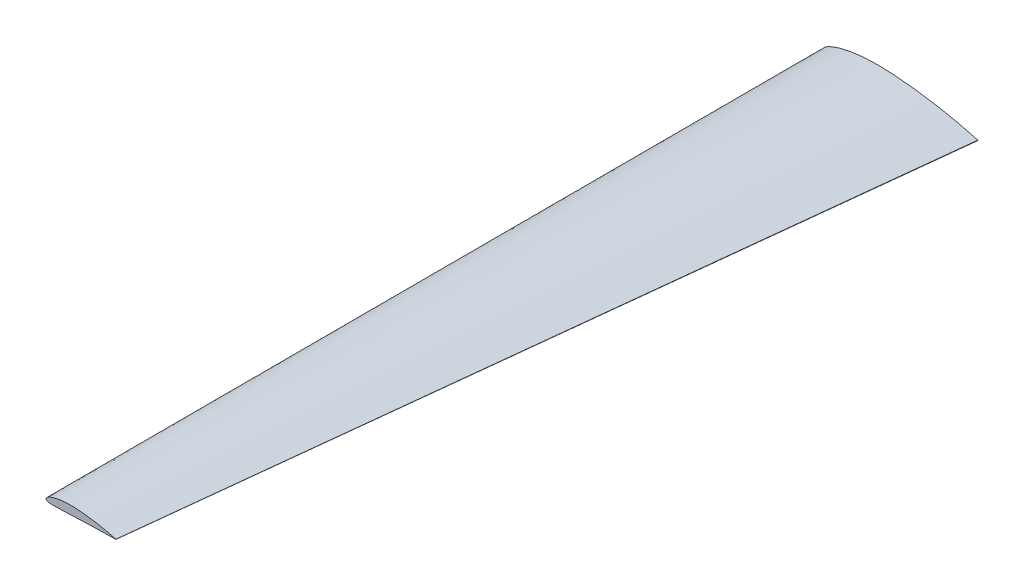
ISO-10303-21;
HEADER;
FILE_DESCRIPTION(('STEP AP214'),'2;1');
FILE_NAME('part.step','',(''),(''),'','','');
FILE_SCHEMA(('AUTOMOTIVE_DESIGN { 1 0 10303 214 1 1 1 1 }'));
ENDSEC;
DATA;
#1=APPLICATION_CONTEXT('core data for automotive mechanical design processes');
#2=APPLICATION_PROTOCOL_DEFINITION('international standard','automotive_design',2000,#1);
#3=PRODUCT_CONTEXT('',#1,'mechanical');
#4=PRODUCT('Part','Part','',(#3));
#5=PRODUCT_RELATED_PRODUCT_CATEGORY('part','',(#4));
#6=PRODUCT_DEFINITION_FORMATION('','',#4);
#7=PRODUCT_DEFINITION_CONTEXT('part definition',#1,'design');
#8=PRODUCT_DEFINITION('design','',#6,#7);
#9=PRODUCT_DEFINITION_SHAPE('','',#8);
#10=(LENGTH_UNIT() NAMED_UNIT(*) SI_UNIT(.MILLI.,.METRE.));
#11=(NAMED_UNIT(*) PLANE_ANGLE_UNIT() SI_UNIT($,.RADIAN.));
#12=(NAMED_UNIT(*) SI_UNIT($,.STERADIAN.) SOLID_ANGLE_UNIT());
#13=UNCERTAINTY_MEASURE_WITH_UNIT(LENGTH_MEASURE(1.E-05),#10,'distance_accuracy_value','');
#14=(GEOMETRIC_REPRESENTATION_CONTEXT(3) GLOBAL_UNCERTAINTY_ASSIGNED_CONTEXT((#13)) GLOBAL_UNIT_ASSIGNED_CONTEXT((#10,
#11,#12)) REPRESENTATION_CONTEXT('',''));
#15=CARTESIAN_POINT('',(0.,0.,0.));
#16=DIRECTION('',(0.,0.,1.));
#17=DIRECTION('',(1.,0.,0.));
#18=AXIS2_PLACEMENT_3D('',#15,#16,#17);
#19=CARTESIAN_POINT('',(0.307784343771572,1.3112450118648,0.));
#20=DIRECTION('',(0.,0.,-1.));
#21=DIRECTION('',(-1.,0.,0.));
#22=AXIS2_PLACEMENT_3D('',#19,#20,#21);
#23=PLANE('',#22);
#24=CARTESIAN_POINT('',(100.04096197,0.130053250561,0.));
#25=CARTESIAN_POINT('',(98.3753316729701,0.583475429002737,0.));
#26=CARTESIAN_POINT('',(95.0521091904116,1.48813163042704,0.));
#27=CARTESIAN_POINT('',(88.3947313343366,3.13301976090769,0.));
#28=CARTESIAN_POINT('',(80.0694508753774,4.95042107994035,0.));
#29=CARTESIAN_POINT('',(70.0557210251099,6.74194401775901,0.));
#30=CARTESIAN_POINT('',(60.0497540430421,8.21043486735902,0.));
#31=CARTESIAN_POINT('',(50.038211825528,9.25790859572359,0.));
#32=CARTESIAN_POINT('',(40.0275419246132,9.91120783425722,0.));
#33=CARTESIAN_POINT('',(31.6705144475124,9.91781497018589,0.));
#34=CARTESIAN_POINT('',(24.9979007479044,9.45618136216528,0.));
#35=CARTESIAN_POINT('',(19.9866790566718,8.8481267951894,0.));
#36=CARTESIAN_POINT('',(14.9646267548574,7.9514227325023,0.));
#37=CARTESIAN_POINT('',(10.8030290110844,6.87300890617338,0.));
#38=CARTESIAN_POINT('',(7.46812163187094,5.78385586445714,0.));
#39=CARTESIAN_POINT('',(4.9535243755495,4.75564505370015,0.));
#40=CARTESIAN_POINT('',(2.8079329818961,3.64366221497252,0.));
#41=CARTESIAN_POINT('',(0.9455578923774,2.31353464766887,0.));
#42=CARTESIAN_POINT('',(-0.675651711912388,0.174268617350082,0.));
#43=CARTESIAN_POINT('',(1.07423072127355,-1.46179805224184,0.));
#44=CARTESIAN_POINT('',(2.85981273554301,-2.10401506077025,0.));
#45=CARTESIAN_POINT('',(4.98631811348761,-2.53748326534589,0.));
#46=CARTESIAN_POINT('',(7.49771569492765,-2.75787063624999,0.));
#47=CARTESIAN_POINT('',(10.8363843588608,-2.91384311784583,0.));
#48=CARTESIAN_POINT('',(15.0071883135003,-2.90216067298378,0.));
#49=CARTESIAN_POINT('',(20.0103634304008,-2.76215512067297,0.));
#50=CARTESIAN_POINT('',(25.0100083397903,-2.49557515072703,0.));
#51=CARTESIAN_POINT('',(31.6794319548279,-2.18365111246574,0.));
#52=CARTESIAN_POINT('',(40.0147877826347,-1.78336854476151,0.));
#53=CARTESIAN_POINT('',(50.0207695103111,-1.40750009041895,0.));
#54=CARTESIAN_POINT('',(60.0235368590097,-0.990130213178029,0.));
#55=CARTESIAN_POINT('',(70.0272613259985,-0.634638099427498,0.));
#56=CARTESIAN_POINT('',(80.0317872183172,-0.373151346268785,0.));
#57=CARTESIAN_POINT('',(88.3692660592836,-0.240386999624823,0.));
#58=CARTESIAN_POINT('',(95.0387618153629,-0.15295481870562,0.));
#59=CARTESIAN_POINT('',(98.3735919292244,-0.137686969210927,0.));
#60=CARTESIAN_POINT('',(100.04096197,-0.130053250561,0.));
#61=B_SPLINE_CURVE_WITH_KNOTS('',3,(#24,#25,#26,#27,#28,#29,#30,#31,#32,#33,#34,#35,#36,#37,#38,
#39,#40,#41,#42,#43,#44,#45,#46,#47,#48,#49,#50,#51,#52,#53,#54,#55,#56,#57,#58,#59,#60),
.UNSPECIFIED.,.F.,.F.,(4,1,1,1,1,1,1,1,1,1,1,1,1,1,1,1,1,1,1,1,1,1,1,1,1,1,1,1,1,1,1,1,1,1,4),
(0.,0.0253048857109568,0.0504876533905406,0.100520432651506,0.150190715723339,0.199586606894546,
0.248740009224029,0.297715538989186,0.346600594361287,0.371102737044853,0.395726297170324,
0.420570145356384,0.445825119255769,0.458702215791061,0.471919981785349,0.485786002851729,
0.493461050828321,0.506863029175843,0.516147770049506,0.522766002591757,0.535269014058866,
0.54755113395783,0.559786370715184,0.584228898401235,0.608680810066395,0.633151283581104,
0.657621757095812,0.706558114036031,0.755481870433228,0.804405626830425,0.853320223819576,
0.902221408341012,0.951113135961066,0.975557227893806,1.),.UNSPECIFIED.);
#62=CARTESIAN_POINT('',(100.04096197,0.130053250561,0.));
#63=VERTEX_POINT('',#62);
#64=CARTESIAN_POINT('',(0.,0.,0.));
#65=VERTEX_POINT('',#64);
#66=EDGE_CURVE('E57',#63,#65,#61,.T.);
#67=ORIENTED_EDGE('',*,*,#66,.F.);
#68=CARTESIAN_POINT('',(100.04096197,-0.130053250561,0.));
#69=CARTESIAN_POINT('',(100.061659731517,-0.123616498370326,0.));
#70=CARTESIAN_POINT('',(100.085119536479,-0.110718274088406,0.));
#71=CARTESIAN_POINT('',(100.123291398132,-0.0658981928025071,0.));
#72=CARTESIAN_POINT('',(100.136714069398,-0.0334251705974836,0.));
#73=CARTESIAN_POINT('',(100.136714069398,0.0334251705974835,0.));
#74=CARTESIAN_POINT('',(100.123291398132,0.0658981928025071,0.));
#75=CARTESIAN_POINT('',(100.085119536479,0.110718274088406,0.));
#76=CARTESIAN_POINT('',(100.061659731517,0.123616498370326,0.));
#77=CARTESIAN_POINT('',(100.04096197,0.130053250561,0.));
#78=B_SPLINE_CURVE_WITH_KNOTS('',3,(#68,#69,#70,#71,#72,#73,#74,#75,#76,#77),.UNSPECIFIED.,.F.,
.F.,(4,2,2,2,4),(0.,0.25,0.5,0.75,1.),.UNSPECIFIED.);
#79=CARTESIAN_POINT('',(100.04096197,-0.130053250561,0.));
#80=VERTEX_POINT('',#79);
#81=EDGE_CURVE('E11',#80,#63,#78,.T.);
#82=ORIENTED_EDGE('',*,*,#81,.F.);
#83=CARTESIAN_POINT('',(100.04096197,0.130053250561,0.));
#84=CARTESIAN_POINT('',(98.3753316729701,0.583475429002737,0.));
#85=CARTESIAN_POINT('',(95.0521091904116,1.48813163042704,0.));
#86=CARTESIAN_POINT('',(88.3947313343366,3.13301976090769,0.));
#87=CARTESIAN_POINT('',(80.0694508753774,4.95042107994035,0.));
#88=CARTESIAN_POINT('',(70.0557210251099,6.74194401775901,0.));
#89=CARTESIAN_POINT('',(60.0497540430421,8.21043486735902,0.));
#90=CARTESIAN_POINT('',(50.038211825528,9.25790859572359,0.));
#91=CARTESIAN_POINT('',(40.0275419246132,9.91120783425722,0.));
#92=CARTESIAN_POINT('',(31.6705144475124,9.91781497018589,0.));
#93=CARTESIAN_POINT('',(24.9979007479044,9.45618136216528,0.));
#94=CARTESIAN_POINT('',(19.9866790566718,8.8481267951894,0.));
#95=CARTESIAN_POINT('',(14.9646267548574,7.9514227325023,0.));
#96=CARTESIAN_POINT('',(10.8030290110844,6.87300890617338,0.));
#97=CARTESIAN_POINT('',(7.46812163187094,5.78385586445714,0.));
#98=CARTESIAN_POINT('',(4.9535243755495,4.75564505370015,0.));
#99=CARTESIAN_POINT('',(2.8079329818961,3.64366221497252,0.));
#100=CARTESIAN_POINT('',(0.9455578923774,2.31353464766887,0.));
#101=CARTESIAN_POINT('',(-0.675651711912388,0.174268617350082,0.));
#102=CARTESIAN_POINT('',(1.07423072127355,-1.46179805224184,0.));
#103=CARTESIAN_POINT('',(2.85981273554301,-2.10401506077025,0.));
#104=CARTESIAN_POINT('',(4.98631811348761,-2.53748326534589,0.));
#105=CARTESIAN_POINT('',(7.49771569492765,-2.75787063624999,0.));
#106=CARTESIAN_POINT('',(10.8363843588608,-2.91384311784583,0.));
#107=CARTESIAN_POINT('',(15.0071883135003,-2.90216067298378,0.));
#108=CARTESIAN_POINT('',(20.0103634304008,-2.76215512067297,0.));
#109=CARTESIAN_POINT('',(25.0100083397903,-2.49557515072703,0.));
#110=CARTESIAN_POINT('',(31.6794319548279,-2.18365111246574,0.));
#111=CARTESIAN_POINT('',(40.0147877826347,-1.78336854476151,0.));
#112=CARTESIAN_POINT('',(50.0207695103111,-1.40750009041895,0.));
#113=CARTESIAN_POINT('',(60.0235368590097,-0.990130213178029,0.));
#114=CARTESIAN_POINT('',(70.0272613259985,-0.634638099427498,0.));
#115=CARTESIAN_POINT('',(80.0317872183172,-0.373151346268785,0.));
#116=CARTESIAN_POINT('',(88.3692660592836,-0.240386999624823,0.));
#117=CARTESIAN_POINT('',(95.0387618153629,-0.15295481870562,0.));
#118=CARTESIAN_POINT('',(98.3735919292244,-0.137686969210927,0.));
#119=CARTESIAN_POINT('',(100.04096197,-0.130053250561,0.));
#120=B_SPLINE_CURVE_WITH_KNOTS('',3,(#83,#84,#85,#86,#87,#88,#89,#90,#91,#92,#93,#94,#95,#96,
#97,#98,#99,#100,#101,#102,#103,#104,#105,#106,#107,#108,#109,#110,#111,#112,#113,#114,#115,
#116,#117,#118,#119),.UNSPECIFIED.,.F.,.F.,(4,1,1,1,1,1,1,1,1,1,1,1,1,1,1,1,1,1,1,1,1,1,1,1,1,1,
1,1,1,1,1,1,1,1,4),(0.,0.0253048857109568,0.0504876533905406,0.100520432651506,
0.150190715723339,0.199586606894546,0.248740009224029,0.297715538989186,0.346600594361287,
0.371102737044853,0.395726297170324,0.420570145356384,0.445825119255769,0.458702215791061,
0.471919981785349,0.485786002851729,0.493461050828321,0.506863029175843,0.516147770049506,
0.522766002591757,0.535269014058866,0.54755113395783,0.559786370715184,0.584228898401235,
0.608680810066395,0.633151283581104,0.657621757095812,0.706558114036031,0.755481870433228,
0.804405626830425,0.853320223819576,0.902221408341012,0.951113135961066,0.975557227893806,1.),.UNSPECIFIED.);
#121=EDGE_CURVE('E155',#65,#80,#120,.T.);
#122=ORIENTED_EDGE('',*,*,#121,.F.);
#123=EDGE_LOOP('',(#67,#82,#122));
#124=FACE_BOUND('',#123,.T.);
#125=ADVANCED_FACE('F46',(#124),#23,.T.);
#126=CARTESIAN_POINT('',(0.138446244129682,0.589818652898058,500.));
#127=DIRECTION('',(0.,0.,-1.));
#128=DIRECTION('',(-1.,0.,0.));
#129=AXIS2_PLACEMENT_3D('',#126,#127,#128);
#130=PLANE('',#129);
#131=CARTESIAN_POINT('',(44.999999916,-0.0584999998908,500.));
#132=CARTESIAN_POINT('',(44.2499906176354,-0.061933766738309,500.));
#133=CARTESIAN_POINT('',(42.7499315229553,-0.0688014858450558,500.));
#134=CARTESIAN_POINT('',(39.7498873155302,-0.108129857509451,500.));
#135=CARTESIAN_POINT('',(35.9995580528463,-0.167849351106661,500.));
#136=CARTESIAN_POINT('',(31.4993647775261,-0.285470209987504,500.));
#137=CARTESIAN_POINT('',(26.9995319959383,-0.445376160249255,500.));
#138=CARTESIAN_POINT('',(22.500129741228,-0.633115702841964,500.));
#139=CARTESIAN_POINT('',(17.9992816082406,-0.802187251943165,500.));
#140=CARTESIAN_POINT('',(14.2499073103043,-0.982240653653438,500.));
#141=CARTESIAN_POINT('',(11.2498955530557,-1.12254899754727,500.));
#142=CARTESIAN_POINT('',(9.00097654955771,-1.24246086553563,500.));
#143=CARTESIAN_POINT('',(6.75046960313539,-1.30543756746014,500.));
#144=CARTESIAN_POINT('',(4.87437631182225,-1.31069251510817,500.));
#145=CARTESIAN_POINT('',(3.37259057687904,-1.24053363697966,500.));
#146=CARTESIAN_POINT('',(2.24292440086072,-1.14139992737833,500.));
#147=CARTESIAN_POINT('',(1.28638879839843,-0.946419103669922,500.));
#148=CARTESIAN_POINT('',(0.483205893017805,-0.657539781033072,500.));
#149=CARTESIAN_POINT('',(-0.303918778674082,0.0783887680774882,500.));
#150=CARTESIAN_POINT('',(0.425326828527658,1.04066431290397,500.));
#151=CARTESIAN_POINT('',(1.26305246832142,1.63897663655878,500.));
#152=CARTESIAN_POINT('',(2.22817326117352,2.13916402644356,500.));
#153=CARTESIAN_POINT('',(3.35927870133484,2.60166943909213,500.));
#154=CARTESIAN_POINT('',(4.85937255118683,3.09158762680848,500.));
#155=CARTESIAN_POINT('',(6.73132474389333,3.5766751463464,500.));
#156=CARTESIAN_POINT('',(8.99032294532573,3.98002675303823,500.));
#157=CARTESIAN_POINT('',(11.2444493675821,4.25353927155083,500.));
#158=CARTESIAN_POINT('',(14.2458960751009,4.46118933721473,500.));
#159=CARTESIAN_POINT('',(18.0050186221263,4.45821734343958,500.));
#160=CARTESIAN_POINT('',(22.5079755692552,4.16435305924815,500.));
#161=CARTESIAN_POINT('',(27.0113248981258,3.69318288295023,500.));
#162=CARTESIAN_POINT('',(31.5121663983062,3.03263257628221,500.));
#163=CARTESIAN_POINT('',(36.0164997588352,2.22677734994475,500.));
#164=CARTESIAN_POINT('',(39.7613419972194,1.40928162026222,500.));
#165=CARTESIAN_POINT('',(42.7559353824169,0.669385039143219,500.));
#166=CARTESIAN_POINT('',(44.2507731817658,0.262456435234848,500.));
#167=CARTESIAN_POINT('',(44.999999916,0.0584999998908,500.));
#168=B_SPLINE_CURVE_WITH_KNOTS('',3,(#131,#132,#133,#134,#135,#136,#137,#138,#139,#140,#141,
#142,#143,#144,#145,#146,#147,#148,#149,#150,#151,#152,#153,#154,#155,#156,#157,#158,#159,#160,
#161,#162,#163,#164,#165,#166,#167),.UNSPECIFIED.,.F.,.F.,(4,1,1,1,1,1,1,1,1,1,1,1,1,1,1,1,1,1,
1,1,1,1,1,1,1,1,1,1,1,1,1,1,1,1,4),(0.,0.0244427721061945,0.0488868640389345,0.0977785916589877,
0.146679776180424,0.195594373169575,0.244518129566772,0.293441885963969,0.342378242904188,
0.366848716418896,0.391319189933605,0.415771101598765,0.440213629284816,0.45244886604217,
0.464730985941134,0.477233997408243,0.483852229950494,0.493136970824157,0.506538949171679,
0.514213997148271,0.528080018214651,0.541297784208939,0.554174880744231,0.579429854643616,
0.604273702829676,0.628897262955147,0.653399405638713,0.702284461010814,0.751259990775971,
0.800413393105454,0.849809284276661,0.899479567348494,0.949512346609459,0.974695114289043,1.),.UNSPECIFIED.);
#169=CARTESIAN_POINT('',(44.999999916,0.0584999998908,500.));
#170=VERTEX_POINT('',#169);
#171=CARTESIAN_POINT('',(44.999999916,-0.0584999998908,500.));
#172=VERTEX_POINT('',#171);
#173=EDGE_CURVE('E87',#170,#172,#168,.F.);
#174=ORIENTED_EDGE('',*,*,#173,.T.);
#175=CARTESIAN_POINT('',(44.999999916,0.0584999998908,500.));
#176=CARTESIAN_POINT('',(45.009416784349,0.0559731263003045,500.));
#177=CARTESIAN_POINT('',(45.0203108055586,0.050540294973394,500.));
#178=CARTESIAN_POINT('',(45.0383661854076,0.0304636053536883,500.));
#179=CARTESIAN_POINT('',(45.0448718285554,0.0154864345690783,500.));
#180=CARTESIAN_POINT('',(45.0448718285554,-0.0154864345690783,500.));
#181=CARTESIAN_POINT('',(45.0383661854076,-0.0304636053536883,500.));
#182=CARTESIAN_POINT('',(45.0203108055586,-0.050540294973394,500.));
#183=CARTESIAN_POINT('',(45.009416784349,-0.0559731263003045,500.));
#184=CARTESIAN_POINT('',(44.999999916,-0.0584999998908,500.));
#185=B_SPLINE_CURVE_WITH_KNOTS('',3,(#175,#176,#177,#178,#179,#180,#181,#182,#183,#184),
.UNSPECIFIED.,.F.,.F.,(4,2,2,2,4),(0.,0.25,0.5,0.75,1.),.UNSPECIFIED.);
#186=EDGE_CURVE('E84',#172,#170,#185,.F.);
#187=ORIENTED_EDGE('',*,*,#186,.T.);
#188=EDGE_LOOP('',(#174,#187));
#189=FACE_BOUND('',#188,.T.);
#190=ADVANCED_FACE('F86',(#189),#130,.F.);
#191=CARTESIAN_POINT('',(44.999999916,0.0584999998908,500.));
#192=CARTESIAN_POINT('',(100.04096197,0.130053250561,0.));
#193=CARTESIAN_POINT('',(45.009416784349,0.0559731263003045,500.));
#194=CARTESIAN_POINT('',(100.061659731517,0.123616498370326,0.));
#195=CARTESIAN_POINT('',(45.0203108055586,0.050540294973394,500.));
#196=CARTESIAN_POINT('',(100.085119536479,0.110718274088406,0.));
#197=CARTESIAN_POINT('',(45.0383661854076,0.0304636053536883,500.));
#198=CARTESIAN_POINT('',(100.123291398132,0.0658981928025071,0.));
#199=CARTESIAN_POINT('',(45.0448718285554,0.0154864345690783,500.));
#200=CARTESIAN_POINT('',(100.136714069398,0.0334251705974835,0.));
#201=CARTESIAN_POINT('',(45.0448718285554,-0.0154864345690783,500.));
#202=CARTESIAN_POINT('',(100.136714069398,-0.0334251705974836,0.));
#203=CARTESIAN_POINT('',(45.0383661854076,-0.0304636053536883,500.));
#204=CARTESIAN_POINT('',(100.123291398132,-0.0658981928025071,0.));
#205=CARTESIAN_POINT('',(45.0203108055586,-0.050540294973394,500.));
#206=CARTESIAN_POINT('',(100.085119536479,-0.110718274088406,0.));
#207=CARTESIAN_POINT('',(45.009416784349,-0.0559731263003045,500.));
#208=CARTESIAN_POINT('',(100.061659731517,-0.123616498370326,0.));
#209=CARTESIAN_POINT('',(44.999999916,-0.0584999998908,500.));
#210=CARTESIAN_POINT('',(100.04096197,-0.130053250561,0.));
#211=B_SPLINE_SURFACE_WITH_KNOTS('',3,1,((#191,#192),(#193,#194),(#195,#196),(#197,#198),(#199,
#200),(#201,#202),(#203,#204),(#205,#206),(#207,#208),(#209,#210)),.UNSPECIFIED.,.F.,.F.,.F.,(4,
2,2,2,4),(2,2),(0.,0.25,0.5,0.75,1.),(0.,1.),.UNSPECIFIED.);
#212=CARTESIAN_POINT('',(44.999999916,-0.0584999998908,500.));
#213=CARTESIAN_POINT('',(100.04096197,-0.130053250561,0.));
#214=B_SPLINE_CURVE_WITH_KNOTS('',1,(#212,#213),.UNSPECIFIED.,.F.,.F.,(2,2),(0.,1.),.UNSPECIFIED.);
#215=EDGE_CURVE('E97',#172,#80,#214,.T.);
#216=CARTESIAN_POINT('',(100.04096197,0.130053250561,0.));
#217=CARTESIAN_POINT('',(44.999999916,0.0584999998908,500.));
#218=B_SPLINE_CURVE_WITH_KNOTS('',1,(#216,#217),.UNSPECIFIED.,.F.,.F.,(2,2),(0.,1.),.UNSPECIFIED.);
#219=EDGE_CURVE('E71',#63,#170,#218,.T.);
#220=ORIENTED_EDGE('',*,*,#186,.F.);
#221=ORIENTED_EDGE('',*,*,#215,.T.);
#222=ORIENTED_EDGE('',*,*,#81,.T.);
#223=ORIENTED_EDGE('',*,*,#219,.T.);
#224=EDGE_LOOP('',(#220,#221,#222,#223));
#225=FACE_BOUND('',#224,.T.);
#226=ADVANCED_FACE('F102',(#225),#211,.T.);
#227=CARTESIAN_POINT('',(44.999999916,-0.0584999998908,500.));
#228=CARTESIAN_POINT('',(100.04096197,-0.130053250561,0.));
#229=CARTESIAN_POINT('',(44.2499906176354,-0.061933766738309,500.));
#230=CARTESIAN_POINT('',(98.3735919292244,-0.137686969210927,0.));
#231=CARTESIAN_POINT('',(42.7499315229553,-0.0688014858450558,500.));
#232=CARTESIAN_POINT('',(95.0387618153629,-0.15295481870562,0.));
#233=CARTESIAN_POINT('',(39.7498873155302,-0.108129857509451,500.));
#234=CARTESIAN_POINT('',(88.3692660592836,-0.240386999624823,0.));
#235=CARTESIAN_POINT('',(35.9995580528463,-0.167849351106661,500.));
#236=CARTESIAN_POINT('',(80.0317872183172,-0.373151346268785,0.));
#237=CARTESIAN_POINT('',(31.4993647775261,-0.285470209987504,500.));
#238=CARTESIAN_POINT('',(70.0272613259985,-0.634638099427498,0.));
#239=CARTESIAN_POINT('',(26.9995319959383,-0.445376160249255,500.));
#240=CARTESIAN_POINT('',(60.0235368590097,-0.990130213178029,0.));
#241=CARTESIAN_POINT('',(22.500129741228,-0.633115702841964,500.));
#242=CARTESIAN_POINT('',(50.0207695103111,-1.40750009041895,0.));
#243=CARTESIAN_POINT('',(17.9992816082406,-0.802187251943165,500.));
#244=CARTESIAN_POINT('',(40.0147877826347,-1.78336854476151,0.));
#245=CARTESIAN_POINT('',(14.2499073103043,-0.982240653653438,500.));
#246=CARTESIAN_POINT('',(31.6794319548279,-2.18365111246574,0.));
#247=CARTESIAN_POINT('',(11.2498955530557,-1.12254899754727,500.));
#248=CARTESIAN_POINT('',(25.0100083397903,-2.49557515072703,0.));
#249=CARTESIAN_POINT('',(9.00097654955771,-1.24246086553563,500.));
#250=CARTESIAN_POINT('',(20.0103634304008,-2.76215512067297,0.));
#251=CARTESIAN_POINT('',(6.75046960313539,-1.30543756746014,500.));
#252=CARTESIAN_POINT('',(15.0071883135003,-2.90216067298378,0.));
#253=CARTESIAN_POINT('',(4.87437631182225,-1.31069251510817,500.));
#254=CARTESIAN_POINT('',(10.8363843588608,-2.91384311784583,0.));
#255=CARTESIAN_POINT('',(3.37259057687904,-1.24053363697966,500.));
#256=CARTESIAN_POINT('',(7.49771569492765,-2.75787063624999,0.));
#257=CARTESIAN_POINT('',(2.24292440086072,-1.14139992737833,500.));
#258=CARTESIAN_POINT('',(4.98631811348761,-2.53748326534589,0.));
#259=CARTESIAN_POINT('',(1.28638879839843,-0.946419103669922,500.));
#260=CARTESIAN_POINT('',(2.85981273554301,-2.10401506077025,0.));
#261=CARTESIAN_POINT('',(0.483205893017805,-0.657539781033072,500.));
#262=CARTESIAN_POINT('',(1.07423072127355,-1.46179805224184,0.));
#263=CARTESIAN_POINT('',(-0.303918778674082,0.0783887680774882,500.));
#264=CARTESIAN_POINT('',(-0.675651711912388,0.174268617350082,0.));
#265=CARTESIAN_POINT('',(0.425326828527658,1.04066431290397,500.));
#266=CARTESIAN_POINT('',(0.9455578923774,2.31353464766887,0.));
#267=CARTESIAN_POINT('',(1.26305246832142,1.63897663655878,500.));
#268=CARTESIAN_POINT('',(2.8079329818961,3.64366221497252,0.));
#269=CARTESIAN_POINT('',(2.22817326117352,2.13916402644356,500.));
#270=CARTESIAN_POINT('',(4.9535243755495,4.75564505370015,0.));
#271=CARTESIAN_POINT('',(3.35927870133484,2.60166943909213,500.));
#272=CARTESIAN_POINT('',(7.46812163187094,5.78385586445714,0.));
#273=CARTESIAN_POINT('',(4.85937255118683,3.09158762680848,500.));
#274=CARTESIAN_POINT('',(10.8030290110844,6.87300890617338,0.));
#275=CARTESIAN_POINT('',(6.73132474389333,3.5766751463464,500.));
#276=CARTESIAN_POINT('',(14.9646267548574,7.9514227325023,0.));
#277=CARTESIAN_POINT('',(8.99032294532573,3.98002675303823,500.));
#278=CARTESIAN_POINT('',(19.9866790566718,8.8481267951894,0.));
#279=CARTESIAN_POINT('',(11.2444493675821,4.25353927155083,500.));
#280=CARTESIAN_POINT('',(24.9979007479044,9.45618136216528,0.));
#281=CARTESIAN_POINT('',(14.2458960751009,4.46118933721473,500.));
#282=CARTESIAN_POINT('',(31.6705144475124,9.91781497018589,0.));
#283=CARTESIAN_POINT('',(18.0050186221263,4.45821734343958,500.));
#284=CARTESIAN_POINT('',(40.0275419246132,9.91120783425722,0.));
#285=CARTESIAN_POINT('',(22.5079755692552,4.16435305924815,500.));
#286=CARTESIAN_POINT('',(50.038211825528,9.25790859572359,0.));
#287=CARTESIAN_POINT('',(27.0113248981258,3.69318288295023,500.));
#288=CARTESIAN_POINT('',(60.0497540430421,8.21043486735902,0.));
#289=CARTESIAN_POINT('',(31.5121663983062,3.03263257628221,500.));
#290=CARTESIAN_POINT('',(70.0557210251099,6.74194401775901,0.));
#291=CARTESIAN_POINT('',(36.0164997588352,2.22677734994475,500.));
#292=CARTESIAN_POINT('',(80.0694508753774,4.95042107994035,0.));
#293=CARTESIAN_POINT('',(39.7613419972194,1.40928162026222,500.));
#294=CARTESIAN_POINT('',(88.3947313343366,3.13301976090769,0.));
#295=CARTESIAN_POINT('',(42.7559353824169,0.669385039143219,500.));
#296=CARTESIAN_POINT('',(95.0521091904116,1.48813163042704,0.));
#297=CARTESIAN_POINT('',(44.2507731817658,0.262456435234848,500.));
#298=CARTESIAN_POINT('',(98.3753316729701,0.583475429002737,0.));
#299=CARTESIAN_POINT('',(44.999999916,0.0584999998908,500.));
#300=CARTESIAN_POINT('',(100.04096197,0.130053250561,0.));
#301=B_SPLINE_SURFACE_WITH_KNOTS('',3,1,((#227,#228),(#229,#230),(#231,#232),(#233,#234),(#235,
#236),(#237,#238),(#239,#240),(#241,#242),(#243,#244),(#245,#246),(#247,#248),(#249,#250),(#251,
#252),(#253,#254),(#255,#256),(#257,#258),(#259,#260),(#261,#262),(#263,#264),(#265,#266),(#267,
#268),(#269,#270),(#271,#272),(#273,#274),(#275,#276),(#277,#278),(#279,#280),(#281,#282),(#283,
#284),(#285,#286),(#287,#288),(#289,#290),(#291,#292),(#293,#294),(#295,#296),(#297,#298),(#299,
#300)),.UNSPECIFIED.,.F.,.F.,.F.,(4,1,1,1,1,1,1,1,1,1,1,1,1,1,1,1,1,1,1,1,1,1,1,1,1,1,1,1,1,1,1,
1,1,1,4),(2,2),(0.,0.0244427721061945,0.0488868640389345,0.0977785916589877,0.146679776180424,
0.195594373169575,0.244518129566772,0.293441885963969,0.342378242904188,0.366848716418896,
0.391319189933605,0.415771101598765,0.440213629284816,0.45244886604217,0.464730985941134,
0.477233997408243,0.483852229950494,0.493136970824157,0.506538949171679,0.514213997148271,
0.528080018214651,0.541297784208939,0.554174880744231,0.579429854643616,0.604273702829676,
0.628897262955147,0.653399405638713,0.702284461010814,0.751259990775971,0.800413393105454,
0.849809284276661,0.899479567348494,0.949512346609459,0.974695114289043,1.),(0.,1.),.UNSPECIFIED.);
#302=ORIENTED_EDGE('',*,*,#173,.F.);
#303=ORIENTED_EDGE('',*,*,#219,.F.);
#304=ORIENTED_EDGE('',*,*,#66,.T.);
#305=ORIENTED_EDGE('',*,*,#121,.T.);
#306=ORIENTED_EDGE('',*,*,#215,.F.);
#307=EDGE_LOOP('',(#302,#303,#304,#305,#306));
#308=FACE_BOUND('',#307,.T.);
#309=ADVANCED_FACE('F96',(#308),#301,.T.);
#310=CLOSED_SHELL('',(#125,#190,#226,#309));
#311=MANIFOLD_SOLID_BREP('B2',#310);
#312=ADVANCED_BREP_SHAPE_REPRESENTATION('',(#18,#311),#14);
#313=SHAPE_DEFINITION_REPRESENTATION(#9,#312);
ENDSEC;
END-ISO-10303-21;
